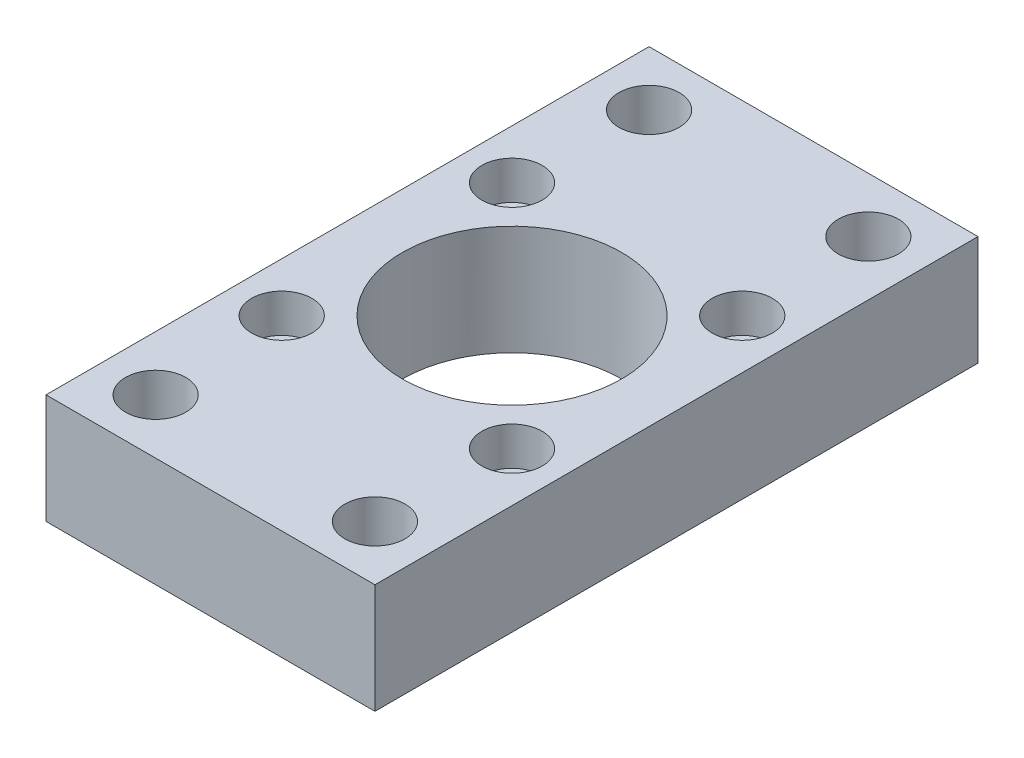
ISO-10303-21;
HEADER;
FILE_DESCRIPTION(('STEP AP214'),'2;1');
FILE_NAME('part.step','',(''),(''),'','','');
FILE_SCHEMA(('AUTOMOTIVE_DESIGN { 1 0 10303 214 1 1 1 1 }'));
ENDSEC;
DATA;
#1=APPLICATION_CONTEXT('core data for automotive mechanical design processes');
#2=APPLICATION_PROTOCOL_DEFINITION('international standard','automotive_design',2000,#1);
#3=PRODUCT_CONTEXT('',#1,'mechanical');
#4=PRODUCT('Part','Part','',(#3));
#5=PRODUCT_RELATED_PRODUCT_CATEGORY('part','',(#4));
#6=PRODUCT_DEFINITION_FORMATION('','',#4);
#7=PRODUCT_DEFINITION_CONTEXT('part definition',#1,'design');
#8=PRODUCT_DEFINITION('design','',#6,#7);
#9=PRODUCT_DEFINITION_SHAPE('','',#8);
#10=(LENGTH_UNIT() NAMED_UNIT(*) SI_UNIT(.MILLI.,.METRE.));
#11=(NAMED_UNIT(*) PLANE_ANGLE_UNIT() SI_UNIT($,.RADIAN.));
#12=(NAMED_UNIT(*) SI_UNIT($,.STERADIAN.) SOLID_ANGLE_UNIT());
#13=UNCERTAINTY_MEASURE_WITH_UNIT(LENGTH_MEASURE(1.E-05),#10,'distance_accuracy_value','');
#14=(GEOMETRIC_REPRESENTATION_CONTEXT(3) GLOBAL_UNCERTAINTY_ASSIGNED_CONTEXT((#13)) GLOBAL_UNIT_ASSIGNED_CONTEXT((#10,
#11,#12)) REPRESENTATION_CONTEXT('',''));
#15=CARTESIAN_POINT('',(0.,0.,0.));
#16=DIRECTION('',(0.,0.,1.));
#17=DIRECTION('',(1.,0.,0.));
#18=AXIS2_PLACEMENT_3D('',#15,#16,#17);
#19=CARTESIAN_POINT('',(-30.,-20.,-55.));
#20=DIRECTION('',(0.,0.,-1.));
#21=DIRECTION('',(0.,1.,0.));
#22=AXIS2_PLACEMENT_3D('',#19,#20,#21);
#23=PLANE('',#22);
#24=DIRECTION('',(1.,0.,0.));
#25=VECTOR('',#24,1.);
#26=CARTESIAN_POINT('',(-30.,0.,-55.));
#27=LINE('',#26,#25);
#28=CARTESIAN_POINT('',(-30.,0.,-55.));
#29=VERTEX_POINT('',#28);
#30=CARTESIAN_POINT('',(30.,0.,-55.));
#31=VERTEX_POINT('',#30);
#32=EDGE_CURVE('E36',#29,#31,#27,.T.);
#33=ORIENTED_EDGE('',*,*,#32,.T.);
#34=DIRECTION('',(0.,1.,0.));
#35=VECTOR('',#34,1.);
#36=CARTESIAN_POINT('',(30.,-20.,-55.));
#37=LINE('',#36,#35);
#38=CARTESIAN_POINT('',(30.,-20.,-55.));
#39=VERTEX_POINT('',#38);
#40=EDGE_CURVE('E73',#39,#31,#37,.T.);
#41=ORIENTED_EDGE('',*,*,#40,.F.);
#42=DIRECTION('',(1.,0.,0.));
#43=VECTOR('',#42,1.);
#44=CARTESIAN_POINT('',(-30.,-20.,-55.));
#45=LINE('',#44,#43);
#46=CARTESIAN_POINT('',(-30.,-20.,-55.));
#47=VERTEX_POINT('',#46);
#48=EDGE_CURVE('E11',#47,#39,#45,.T.);
#49=ORIENTED_EDGE('',*,*,#48,.F.);
#50=DIRECTION('',(0.,1.,0.));
#51=VECTOR('',#50,1.);
#52=CARTESIAN_POINT('',(-30.,-20.,-55.));
#53=LINE('',#52,#51);
#54=EDGE_CURVE('E74',#47,#29,#53,.T.);
#55=ORIENTED_EDGE('',*,*,#54,.T.);
#56=EDGE_LOOP('',(#33,#41,#49,#55));
#57=FACE_BOUND('',#56,.T.);
#58=ADVANCED_FACE('F33',(#57),#23,.T.);
#59=CARTESIAN_POINT('',(-30.,-20.,55.));
#60=DIRECTION('',(0.,-1.,0.));
#61=DIRECTION('',(0.,0.,-1.));
#62=AXIS2_PLACEMENT_3D('',#59,#60,#61);
#63=PLANE('',#62);
#64=CARTESIAN_POINT('',(-20.,-20.,45.));
#65=DIRECTION('',(0.,-1.,0.));
#66=DIRECTION('',(0.,0.,-1.));
#67=AXIS2_PLACEMENT_3D('',#64,#65,#66);
#68=CIRCLE('',#67,5.5);
#69=CARTESIAN_POINT('',(-20.,-20.,39.5));
#70=VERTEX_POINT('',#69);
#71=EDGE_CURVE('E135',#70,#70,#68,.F.);
#72=ORIENTED_EDGE('',*,*,#71,.T.);
#73=EDGE_LOOP('',(#72));
#74=FACE_BOUND('',#73,.T.);
#75=CARTESIAN_POINT('',(20.,-20.,45.));
#76=DIRECTION('',(0.,-1.,0.));
#77=DIRECTION('',(0.,0.,-1.));
#78=AXIS2_PLACEMENT_3D('',#75,#76,#77);
#79=CIRCLE('',#78,5.5);
#80=CARTESIAN_POINT('',(20.,-20.,39.5));
#81=VERTEX_POINT('',#80);
#82=EDGE_CURVE('E139',#81,#81,#79,.F.);
#83=ORIENTED_EDGE('',*,*,#82,.T.);
#84=EDGE_LOOP('',(#83));
#85=FACE_BOUND('',#84,.T.);
#86=CARTESIAN_POINT('',(20.,-20.,-45.));
#87=DIRECTION('',(0.,-1.,0.));
#88=DIRECTION('',(0.,0.,-1.));
#89=AXIS2_PLACEMENT_3D('',#86,#87,#88);
#90=CIRCLE('',#89,5.5);
#91=CARTESIAN_POINT('',(20.,-20.,-50.5));
#92=VERTEX_POINT('',#91);
#93=EDGE_CURVE('E143',#92,#92,#90,.F.);
#94=ORIENTED_EDGE('',*,*,#93,.T.);
#95=EDGE_LOOP('',(#94));
#96=FACE_BOUND('',#95,.T.);
#97=CARTESIAN_POINT('',(-20.,-20.,-45.));
#98=DIRECTION('',(0.,-1.,0.));
#99=DIRECTION('',(0.,0.,-1.));
#100=AXIS2_PLACEMENT_3D('',#97,#98,#99);
#101=CIRCLE('',#100,5.5);
#102=CARTESIAN_POINT('',(-20.,-20.,-50.5));
#103=VERTEX_POINT('',#102);
#104=EDGE_CURVE('E147',#103,#103,#101,.F.);
#105=ORIENTED_EDGE('',*,*,#104,.T.);
#106=EDGE_LOOP('',(#105));
#107=FACE_BOUND('',#106,.T.);
#108=CARTESIAN_POINT('',(-21.,-20.,21.));
#109=DIRECTION('',(0.,-1.,0.));
#110=DIRECTION('',(0.,0.,-1.));
#111=AXIS2_PLACEMENT_3D('',#108,#109,#110);
#112=CIRCLE('',#111,3.25);
#113=CARTESIAN_POINT('',(-21.,-20.,17.75));
#114=VERTEX_POINT('',#113);
#115=EDGE_CURVE('E151',#114,#114,#112,.F.);
#116=ORIENTED_EDGE('',*,*,#115,.T.);
#117=EDGE_LOOP('',(#116));
#118=FACE_BOUND('',#117,.T.);
#119=CARTESIAN_POINT('',(21.,-20.,21.));
#120=DIRECTION('',(0.,-1.,0.));
#121=DIRECTION('',(0.,0.,-1.));
#122=AXIS2_PLACEMENT_3D('',#119,#120,#121);
#123=CIRCLE('',#122,3.25);
#124=CARTESIAN_POINT('',(21.,-20.,17.75));
#125=VERTEX_POINT('',#124);
#126=EDGE_CURVE('E155',#125,#125,#123,.F.);
#127=ORIENTED_EDGE('',*,*,#126,.T.);
#128=EDGE_LOOP('',(#127));
#129=FACE_BOUND('',#128,.T.);
#130=CARTESIAN_POINT('',(21.,-20.,-21.));
#131=DIRECTION('',(0.,-1.,0.));
#132=DIRECTION('',(0.,0.,-1.));
#133=AXIS2_PLACEMENT_3D('',#130,#131,#132);
#134=CIRCLE('',#133,3.25);
#135=CARTESIAN_POINT('',(21.,-20.,-24.25));
#136=VERTEX_POINT('',#135);
#137=EDGE_CURVE('E159',#136,#136,#134,.F.);
#138=ORIENTED_EDGE('',*,*,#137,.T.);
#139=EDGE_LOOP('',(#138));
#140=FACE_BOUND('',#139,.T.);
#141=CARTESIAN_POINT('',(-21.,-20.,-21.));
#142=DIRECTION('',(0.,-1.,0.));
#143=DIRECTION('',(0.,0.,-1.));
#144=AXIS2_PLACEMENT_3D('',#141,#142,#143);
#145=CIRCLE('',#144,3.25);
#146=CARTESIAN_POINT('',(-21.,-20.,-24.25));
#147=VERTEX_POINT('',#146);
#148=EDGE_CURVE('E163',#147,#147,#145,.F.);
#149=ORIENTED_EDGE('',*,*,#148,.T.);
#150=EDGE_LOOP('',(#149));
#151=FACE_BOUND('',#150,.T.);
#152=CARTESIAN_POINT('',(0.,-20.,0.));
#153=DIRECTION('',(0.,-1.,0.));
#154=DIRECTION('',(0.,0.,-1.));
#155=AXIS2_PLACEMENT_3D('',#152,#153,#154);
#156=CIRCLE('',#155,20.);
#157=CARTESIAN_POINT('',(0.,-20.,-20.));
#158=VERTEX_POINT('',#157);
#159=EDGE_CURVE('E94',#158,#158,#156,.F.);
#160=ORIENTED_EDGE('',*,*,#159,.T.);
#161=EDGE_LOOP('',(#160));
#162=FACE_BOUND('',#161,.T.);
#163=ORIENTED_EDGE('',*,*,#48,.T.);
#164=DIRECTION('',(0.,0.,-1.));
#165=VECTOR('',#164,1.);
#166=CARTESIAN_POINT('',(30.,-20.,55.));
#167=LINE('',#166,#165);
#168=CARTESIAN_POINT('',(30.,-20.,55.));
#169=VERTEX_POINT('',#168);
#170=EDGE_CURVE('E90',#169,#39,#167,.T.);
#171=ORIENTED_EDGE('',*,*,#170,.F.);
#172=DIRECTION('',(1.,0.,0.));
#173=VECTOR('',#172,1.);
#174=CARTESIAN_POINT('',(-30.,-20.,55.));
#175=LINE('',#174,#173);
#176=CARTESIAN_POINT('',(-30.,-20.,55.));
#177=VERTEX_POINT('',#176);
#178=EDGE_CURVE('E41',#177,#169,#175,.T.);
#179=ORIENTED_EDGE('',*,*,#178,.F.);
#180=DIRECTION('',(0.,0.,-1.));
#181=VECTOR('',#180,1.);
#182=CARTESIAN_POINT('',(-30.,-20.,55.));
#183=LINE('',#182,#181);
#184=EDGE_CURVE('E79',#177,#47,#183,.T.);
#185=ORIENTED_EDGE('',*,*,#184,.T.);
#186=EDGE_LOOP('',(#163,#171,#179,#185));
#187=FACE_BOUND('',#186,.T.);
#188=ADVANCED_FACE('F110',(#74,#85,#96,#107,#118,#129,#140,#151,#162,#187),#63,.T.);
#189=CARTESIAN_POINT('',(-30.,0.,55.));
#190=DIRECTION('',(0.,0.,1.));
#191=DIRECTION('',(0.,-1.,0.));
#192=AXIS2_PLACEMENT_3D('',#189,#190,#191);
#193=PLANE('',#192);
#194=ORIENTED_EDGE('',*,*,#178,.T.);
#195=DIRECTION('',(0.,-1.,0.));
#196=VECTOR('',#195,1.);
#197=CARTESIAN_POINT('',(30.,0.,55.));
#198=LINE('',#197,#196);
#199=CARTESIAN_POINT('',(30.,0.,55.));
#200=VERTEX_POINT('',#199);
#201=EDGE_CURVE('E86',#200,#169,#198,.T.);
#202=ORIENTED_EDGE('',*,*,#201,.F.);
#203=DIRECTION('',(1.,0.,0.));
#204=VECTOR('',#203,1.);
#205=CARTESIAN_POINT('',(-30.,0.,55.));
#206=LINE('',#205,#204);
#207=CARTESIAN_POINT('',(-30.,0.,55.));
#208=VERTEX_POINT('',#207);
#209=EDGE_CURVE('E78',#208,#200,#206,.T.);
#210=ORIENTED_EDGE('',*,*,#209,.F.);
#211=DIRECTION('',(0.,-1.,0.));
#212=VECTOR('',#211,1.);
#213=CARTESIAN_POINT('',(-30.,0.,55.));
#214=LINE('',#213,#212);
#215=EDGE_CURVE('E103',#208,#177,#214,.T.);
#216=ORIENTED_EDGE('',*,*,#215,.T.);
#217=EDGE_LOOP('',(#194,#202,#210,#216));
#218=FACE_BOUND('',#217,.T.);
#219=ADVANCED_FACE('F107',(#218),#193,.T.);
#220=CARTESIAN_POINT('',(-30.,0.,-55.));
#221=DIRECTION('',(0.,1.,0.));
#222=DIRECTION('',(0.,0.,1.));
#223=AXIS2_PLACEMENT_3D('',#220,#221,#222);
#224=PLANE('',#223);
#225=CARTESIAN_POINT('',(-20.,0.,45.));
#226=DIRECTION('',(0.,1.,0.));
#227=DIRECTION('',(0.,0.,1.));
#228=AXIS2_PLACEMENT_3D('',#225,#226,#227);
#229=CIRCLE('',#228,5.5);
#230=CARTESIAN_POINT('',(-20.,0.,50.5));
#231=VERTEX_POINT('',#230);
#232=EDGE_CURVE('E220',#231,#231,#229,.T.);
#233=ORIENTED_EDGE('',*,*,#232,.F.);
#234=EDGE_LOOP('',(#233));
#235=FACE_BOUND('',#234,.T.);
#236=CARTESIAN_POINT('',(20.,0.,45.));
#237=DIRECTION('',(0.,1.,0.));
#238=DIRECTION('',(0.,0.,1.));
#239=AXIS2_PLACEMENT_3D('',#236,#237,#238);
#240=CIRCLE('',#239,5.5);
#241=CARTESIAN_POINT('',(20.,0.,50.5));
#242=VERTEX_POINT('',#241);
#243=EDGE_CURVE('E216',#242,#242,#240,.T.);
#244=ORIENTED_EDGE('',*,*,#243,.F.);
#245=EDGE_LOOP('',(#244));
#246=FACE_BOUND('',#245,.T.);
#247=CARTESIAN_POINT('',(20.,0.,-45.));
#248=DIRECTION('',(0.,1.,0.));
#249=DIRECTION('',(0.,0.,1.));
#250=AXIS2_PLACEMENT_3D('',#247,#248,#249);
#251=CIRCLE('',#250,5.5);
#252=CARTESIAN_POINT('',(20.,0.,-39.5));
#253=VERTEX_POINT('',#252);
#254=EDGE_CURVE('E212',#253,#253,#251,.T.);
#255=ORIENTED_EDGE('',*,*,#254,.F.);
#256=EDGE_LOOP('',(#255));
#257=FACE_BOUND('',#256,.T.);
#258=CARTESIAN_POINT('',(-20.,0.,-45.));
#259=DIRECTION('',(0.,1.,0.));
#260=DIRECTION('',(0.,0.,1.));
#261=AXIS2_PLACEMENT_3D('',#258,#259,#260);
#262=CIRCLE('',#261,5.5);
#263=CARTESIAN_POINT('',(-20.,0.,-39.5));
#264=VERTEX_POINT('',#263);
#265=EDGE_CURVE('E208',#264,#264,#262,.T.);
#266=ORIENTED_EDGE('',*,*,#265,.F.);
#267=EDGE_LOOP('',(#266));
#268=FACE_BOUND('',#267,.T.);
#269=CARTESIAN_POINT('',(-21.,0.,21.));
#270=DIRECTION('',(0.,1.,0.));
#271=DIRECTION('',(0.,0.,1.));
#272=AXIS2_PLACEMENT_3D('',#269,#270,#271);
#273=CIRCLE('',#272,5.5);
#274=CARTESIAN_POINT('',(-21.,0.,26.5));
#275=VERTEX_POINT('',#274);
#276=EDGE_CURVE('E189',#275,#275,#273,.T.);
#277=ORIENTED_EDGE('',*,*,#276,.F.);
#278=EDGE_LOOP('',(#277));
#279=FACE_BOUND('',#278,.T.);
#280=CARTESIAN_POINT('',(21.,0.,21.));
#281=DIRECTION('',(0.,1.,0.));
#282=DIRECTION('',(0.,0.,1.));
#283=AXIS2_PLACEMENT_3D('',#280,#281,#282);
#284=CIRCLE('',#283,5.5);
#285=CARTESIAN_POINT('',(21.,0.,26.5));
#286=VERTEX_POINT('',#285);
#287=EDGE_CURVE('E183',#286,#286,#284,.T.);
#288=ORIENTED_EDGE('',*,*,#287,.F.);
#289=EDGE_LOOP('',(#288));
#290=FACE_BOUND('',#289,.T.);
#291=CARTESIAN_POINT('',(21.,0.,-21.));
#292=DIRECTION('',(0.,1.,0.));
#293=DIRECTION('',(0.,0.,1.));
#294=AXIS2_PLACEMENT_3D('',#291,#292,#293);
#295=CIRCLE('',#294,5.5);
#296=CARTESIAN_POINT('',(21.,0.,-15.5));
#297=VERTEX_POINT('',#296);
#298=EDGE_CURVE('E177',#297,#297,#295,.T.);
#299=ORIENTED_EDGE('',*,*,#298,.F.);
#300=EDGE_LOOP('',(#299));
#301=FACE_BOUND('',#300,.T.);
#302=CARTESIAN_POINT('',(-21.,0.,-21.));
#303=DIRECTION('',(0.,1.,0.));
#304=DIRECTION('',(0.,0.,1.));
#305=AXIS2_PLACEMENT_3D('',#302,#303,#304);
#306=CIRCLE('',#305,5.5);
#307=CARTESIAN_POINT('',(-21.,0.,-15.5));
#308=VERTEX_POINT('',#307);
#309=EDGE_CURVE('E169',#308,#308,#306,.T.);
#310=ORIENTED_EDGE('',*,*,#309,.F.);
#311=EDGE_LOOP('',(#310));
#312=FACE_BOUND('',#311,.T.);
#313=CARTESIAN_POINT('',(0.,0.,0.));
#314=DIRECTION('',(0.,1.,0.));
#315=DIRECTION('',(0.,0.,1.));
#316=AXIS2_PLACEMENT_3D('',#313,#314,#315);
#317=CIRCLE('',#316,20.);
#318=CARTESIAN_POINT('',(0.,0.,20.));
#319=VERTEX_POINT('',#318);
#320=EDGE_CURVE('E91',#319,#319,#317,.T.);
#321=ORIENTED_EDGE('',*,*,#320,.F.);
#322=EDGE_LOOP('',(#321));
#323=FACE_BOUND('',#322,.T.);
#324=ORIENTED_EDGE('',*,*,#209,.T.);
#325=DIRECTION('',(0.,0.,1.));
#326=VECTOR('',#325,1.);
#327=CARTESIAN_POINT('',(30.,0.,-55.));
#328=LINE('',#327,#326);
#329=EDGE_CURVE('E81',#31,#200,#328,.T.);
#330=ORIENTED_EDGE('',*,*,#329,.F.);
#331=ORIENTED_EDGE('',*,*,#32,.F.);
#332=DIRECTION('',(0.,0.,1.));
#333=VECTOR('',#332,1.);
#334=CARTESIAN_POINT('',(-30.,0.,-55.));
#335=LINE('',#334,#333);
#336=EDGE_CURVE('E101',#29,#208,#335,.T.);
#337=ORIENTED_EDGE('',*,*,#336,.T.);
#338=EDGE_LOOP('',(#324,#330,#331,#337));
#339=FACE_BOUND('',#338,.T.);
#340=ADVANCED_FACE('F82',(#235,#246,#257,#268,#279,#290,#301,#312,#323,#339),#224,.T.);
#341=CARTESIAN_POINT('',(-30.,0.,0.));
#342=DIRECTION('',(1.,0.,0.));
#343=DIRECTION('',(0.,0.,-1.));
#344=AXIS2_PLACEMENT_3D('',#341,#342,#343);
#345=PLANE('',#344);
#346=ORIENTED_EDGE('',*,*,#54,.F.);
#347=ORIENTED_EDGE('',*,*,#184,.F.);
#348=ORIENTED_EDGE('',*,*,#215,.F.);
#349=ORIENTED_EDGE('',*,*,#336,.F.);
#350=EDGE_LOOP('',(#346,#347,#348,#349));
#351=FACE_BOUND('',#350,.T.);
#352=ADVANCED_FACE('F112',(#351),#345,.F.);
#353=CARTESIAN_POINT('',(30.,0.,0.));
#354=DIRECTION('',(1.,0.,0.));
#355=DIRECTION('',(0.,0.,-1.));
#356=AXIS2_PLACEMENT_3D('',#353,#354,#355);
#357=PLANE('',#356);
#358=ORIENTED_EDGE('',*,*,#40,.T.);
#359=ORIENTED_EDGE('',*,*,#329,.T.);
#360=ORIENTED_EDGE('',*,*,#201,.T.);
#361=ORIENTED_EDGE('',*,*,#170,.T.);
#362=EDGE_LOOP('',(#358,#359,#360,#361));
#363=FACE_BOUND('',#362,.T.);
#364=ADVANCED_FACE('F89',(#363),#357,.T.);
#365=CARTESIAN_POINT('',(0.,-20.001,0.));
#366=DIRECTION('',(0.,1.,0.));
#367=DIRECTION('',(0.,0.,1.));
#368=AXIS2_PLACEMENT_3D('',#365,#366,#367);
#369=CYLINDRICAL_SURFACE('',#368,20.);
#370=ORIENTED_EDGE('',*,*,#159,.F.);
#371=EDGE_LOOP('',(#370));
#372=FACE_BOUND('',#371,.T.);
#373=ORIENTED_EDGE('',*,*,#320,.T.);
#374=EDGE_LOOP('',(#373));
#375=FACE_BOUND('',#374,.T.);
#376=ADVANCED_FACE('F119',(#372,#375),#369,.F.);
#377=CARTESIAN_POINT('',(-21.,-7.,-21.));
#378=DIRECTION('',(0.,1.,0.));
#379=DIRECTION('',(0.,0.,1.));
#380=AXIS2_PLACEMENT_3D('',#377,#378,#379);
#381=CYLINDRICAL_SURFACE('',#380,5.5);
#382=CARTESIAN_POINT('',(-21.,-7.,-21.));
#383=DIRECTION('',(0.,1.,0.));
#384=DIRECTION('',(0.,0.,1.));
#385=AXIS2_PLACEMENT_3D('',#382,#383,#384);
#386=CIRCLE('',#385,5.5);
#387=CARTESIAN_POINT('',(-21.,-7.,-15.5));
#388=VERTEX_POINT('',#387);
#389=EDGE_CURVE('E167',#388,#388,#386,.T.);
#390=ORIENTED_EDGE('',*,*,#389,.F.);
#391=EDGE_LOOP('',(#390));
#392=FACE_BOUND('',#391,.T.);
#393=ORIENTED_EDGE('',*,*,#309,.T.);
#394=EDGE_LOOP('',(#393));
#395=FACE_BOUND('',#394,.T.);
#396=ADVANCED_FACE('F246',(#392,#395),#381,.F.);
#397=CARTESIAN_POINT('',(-21.,-7.,-21.));
#398=DIRECTION('',(0.,1.,0.));
#399=DIRECTION('',(0.,0.,1.));
#400=AXIS2_PLACEMENT_3D('',#397,#398,#399);
#401=PLANE('',#400);
#402=CARTESIAN_POINT('',(-21.,-7.,-21.));
#403=DIRECTION('',(0.,1.,0.));
#404=DIRECTION('',(0.,0.,1.));
#405=AXIS2_PLACEMENT_3D('',#402,#403,#404);
#406=CIRCLE('',#405,3.25);
#407=CARTESIAN_POINT('',(-21.,-7.,-17.75));
#408=VERTEX_POINT('',#407);
#409=EDGE_CURVE('E192',#408,#408,#406,.T.);
#410=ORIENTED_EDGE('',*,*,#409,.F.);
#411=EDGE_LOOP('',(#410));
#412=FACE_BOUND('',#411,.T.);
#413=ORIENTED_EDGE('',*,*,#389,.T.);
#414=EDGE_LOOP('',(#413));
#415=FACE_BOUND('',#414,.T.);
#416=ADVANCED_FACE('F251',(#412,#415),#401,.T.);
#417=CARTESIAN_POINT('',(21.,-7.,-21.));
#418=DIRECTION('',(0.,1.,0.));
#419=DIRECTION('',(0.,0.,1.));
#420=AXIS2_PLACEMENT_3D('',#417,#418,#419);
#421=CYLINDRICAL_SURFACE('',#420,5.5);
#422=CARTESIAN_POINT('',(21.,-7.,-21.));
#423=DIRECTION('',(0.,1.,0.));
#424=DIRECTION('',(0.,0.,1.));
#425=AXIS2_PLACEMENT_3D('',#422,#423,#424);
#426=CIRCLE('',#425,5.5);
#427=CARTESIAN_POINT('',(21.,-7.,-15.5));
#428=VERTEX_POINT('',#427);
#429=EDGE_CURVE('E174',#428,#428,#426,.T.);
#430=ORIENTED_EDGE('',*,*,#429,.F.);
#431=EDGE_LOOP('',(#430));
#432=FACE_BOUND('',#431,.T.);
#433=ORIENTED_EDGE('',*,*,#298,.T.);
#434=EDGE_LOOP('',(#433));
#435=FACE_BOUND('',#434,.T.);
#436=ADVANCED_FACE('F257',(#432,#435),#421,.F.);
#437=CARTESIAN_POINT('',(21.,-7.,-21.));
#438=DIRECTION('',(0.,1.,0.));
#439=DIRECTION('',(0.,0.,1.));
#440=AXIS2_PLACEMENT_3D('',#437,#438,#439);
#441=PLANE('',#440);
#442=CARTESIAN_POINT('',(21.,-7.,-21.));
#443=DIRECTION('',(0.,1.,0.));
#444=DIRECTION('',(0.,0.,1.));
#445=AXIS2_PLACEMENT_3D('',#442,#443,#444);
#446=CIRCLE('',#445,3.25);
#447=CARTESIAN_POINT('',(21.,-7.,-17.75));
#448=VERTEX_POINT('',#447);
#449=EDGE_CURVE('E196',#448,#448,#446,.T.);
#450=ORIENTED_EDGE('',*,*,#449,.F.);
#451=EDGE_LOOP('',(#450));
#452=FACE_BOUND('',#451,.T.);
#453=ORIENTED_EDGE('',*,*,#429,.T.);
#454=EDGE_LOOP('',(#453));
#455=FACE_BOUND('',#454,.T.);
#456=ADVANCED_FACE('F261',(#452,#455),#441,.T.);
#457=CARTESIAN_POINT('',(21.,-7.,21.));
#458=DIRECTION('',(0.,1.,0.));
#459=DIRECTION('',(0.,0.,1.));
#460=AXIS2_PLACEMENT_3D('',#457,#458,#459);
#461=CYLINDRICAL_SURFACE('',#460,5.5);
#462=CARTESIAN_POINT('',(21.,-7.,21.));
#463=DIRECTION('',(0.,1.,0.));
#464=DIRECTION('',(0.,0.,1.));
#465=AXIS2_PLACEMENT_3D('',#462,#463,#464);
#466=CIRCLE('',#465,5.5);
#467=CARTESIAN_POINT('',(21.,-7.,26.5));
#468=VERTEX_POINT('',#467);
#469=EDGE_CURVE('E180',#468,#468,#466,.T.);
#470=ORIENTED_EDGE('',*,*,#469,.F.);
#471=EDGE_LOOP('',(#470));
#472=FACE_BOUND('',#471,.T.);
#473=ORIENTED_EDGE('',*,*,#287,.T.);
#474=EDGE_LOOP('',(#473));
#475=FACE_BOUND('',#474,.T.);
#476=ADVANCED_FACE('F265',(#472,#475),#461,.F.);
#477=CARTESIAN_POINT('',(21.,-7.,21.));
#478=DIRECTION('',(0.,1.,0.));
#479=DIRECTION('',(0.,0.,1.));
#480=AXIS2_PLACEMENT_3D('',#477,#478,#479);
#481=PLANE('',#480);
#482=CARTESIAN_POINT('',(21.,-7.,21.));
#483=DIRECTION('',(0.,1.,0.));
#484=DIRECTION('',(0.,0.,1.));
#485=AXIS2_PLACEMENT_3D('',#482,#483,#484);
#486=CIRCLE('',#485,3.25);
#487=CARTESIAN_POINT('',(21.,-7.,24.25));
#488=VERTEX_POINT('',#487);
#489=EDGE_CURVE('E200',#488,#488,#486,.T.);
#490=ORIENTED_EDGE('',*,*,#489,.F.);
#491=EDGE_LOOP('',(#490));
#492=FACE_BOUND('',#491,.T.);
#493=ORIENTED_EDGE('',*,*,#469,.T.);
#494=EDGE_LOOP('',(#493));
#495=FACE_BOUND('',#494,.T.);
#496=ADVANCED_FACE('F269',(#492,#495),#481,.T.);
#497=CARTESIAN_POINT('',(-21.,-7.,21.));
#498=DIRECTION('',(0.,1.,0.));
#499=DIRECTION('',(0.,0.,1.));
#500=AXIS2_PLACEMENT_3D('',#497,#498,#499);
#501=CYLINDRICAL_SURFACE('',#500,5.5);
#502=CARTESIAN_POINT('',(-21.,-7.,21.));
#503=DIRECTION('',(0.,1.,0.));
#504=DIRECTION('',(0.,0.,1.));
#505=AXIS2_PLACEMENT_3D('',#502,#503,#504);
#506=CIRCLE('',#505,5.5);
#507=CARTESIAN_POINT('',(-21.,-7.,26.5));
#508=VERTEX_POINT('',#507);
#509=EDGE_CURVE('E186',#508,#508,#506,.T.);
#510=ORIENTED_EDGE('',*,*,#509,.F.);
#511=EDGE_LOOP('',(#510));
#512=FACE_BOUND('',#511,.T.);
#513=ORIENTED_EDGE('',*,*,#276,.T.);
#514=EDGE_LOOP('',(#513));
#515=FACE_BOUND('',#514,.T.);
#516=ADVANCED_FACE('F273',(#512,#515),#501,.F.);
#517=CARTESIAN_POINT('',(-21.,-7.,21.));
#518=DIRECTION('',(0.,1.,0.));
#519=DIRECTION('',(0.,0.,1.));
#520=AXIS2_PLACEMENT_3D('',#517,#518,#519);
#521=PLANE('',#520);
#522=CARTESIAN_POINT('',(-21.,-7.,21.));
#523=DIRECTION('',(0.,1.,0.));
#524=DIRECTION('',(0.,0.,1.));
#525=AXIS2_PLACEMENT_3D('',#522,#523,#524);
#526=CIRCLE('',#525,3.25);
#527=CARTESIAN_POINT('',(-21.,-7.,24.25));
#528=VERTEX_POINT('',#527);
#529=EDGE_CURVE('E204',#528,#528,#526,.T.);
#530=ORIENTED_EDGE('',*,*,#529,.F.);
#531=EDGE_LOOP('',(#530));
#532=FACE_BOUND('',#531,.T.);
#533=ORIENTED_EDGE('',*,*,#509,.T.);
#534=EDGE_LOOP('',(#533));
#535=FACE_BOUND('',#534,.T.);
#536=ADVANCED_FACE('F277',(#532,#535),#521,.T.);
#537=CARTESIAN_POINT('',(-21.,-20.001,-21.));
#538=DIRECTION('',(0.,1.,0.));
#539=DIRECTION('',(0.,0.,1.));
#540=AXIS2_PLACEMENT_3D('',#537,#538,#539);
#541=CYLINDRICAL_SURFACE('',#540,3.25);
#542=ORIENTED_EDGE('',*,*,#148,.F.);
#543=EDGE_LOOP('',(#542));
#544=FACE_BOUND('',#543,.T.);
#545=ORIENTED_EDGE('',*,*,#409,.T.);
#546=EDGE_LOOP('',(#545));
#547=FACE_BOUND('',#546,.T.);
#548=ADVANCED_FACE('F281',(#544,#547),#541,.F.);
#549=CARTESIAN_POINT('',(21.,-20.001,-21.));
#550=DIRECTION('',(0.,1.,0.));
#551=DIRECTION('',(0.,0.,1.));
#552=AXIS2_PLACEMENT_3D('',#549,#550,#551);
#553=CYLINDRICAL_SURFACE('',#552,3.25);
#554=ORIENTED_EDGE('',*,*,#137,.F.);
#555=EDGE_LOOP('',(#554));
#556=FACE_BOUND('',#555,.T.);
#557=ORIENTED_EDGE('',*,*,#449,.T.);
#558=EDGE_LOOP('',(#557));
#559=FACE_BOUND('',#558,.T.);
#560=ADVANCED_FACE('F285',(#556,#559),#553,.F.);
#561=CARTESIAN_POINT('',(21.,-20.001,21.));
#562=DIRECTION('',(0.,1.,0.));
#563=DIRECTION('',(0.,0.,1.));
#564=AXIS2_PLACEMENT_3D('',#561,#562,#563);
#565=CYLINDRICAL_SURFACE('',#564,3.25);
#566=ORIENTED_EDGE('',*,*,#126,.F.);
#567=EDGE_LOOP('',(#566));
#568=FACE_BOUND('',#567,.T.);
#569=ORIENTED_EDGE('',*,*,#489,.T.);
#570=EDGE_LOOP('',(#569));
#571=FACE_BOUND('',#570,.T.);
#572=ADVANCED_FACE('F289',(#568,#571),#565,.F.);
#573=CARTESIAN_POINT('',(-21.,-20.001,21.));
#574=DIRECTION('',(0.,1.,0.));
#575=DIRECTION('',(0.,0.,1.));
#576=AXIS2_PLACEMENT_3D('',#573,#574,#575);
#577=CYLINDRICAL_SURFACE('',#576,3.25);
#578=ORIENTED_EDGE('',*,*,#115,.F.);
#579=EDGE_LOOP('',(#578));
#580=FACE_BOUND('',#579,.T.);
#581=ORIENTED_EDGE('',*,*,#529,.T.);
#582=EDGE_LOOP('',(#581));
#583=FACE_BOUND('',#582,.T.);
#584=ADVANCED_FACE('F293',(#580,#583),#577,.F.);
#585=CARTESIAN_POINT('',(-20.,-20.001,-45.));
#586=DIRECTION('',(0.,1.,0.));
#587=DIRECTION('',(0.,0.,1.));
#588=AXIS2_PLACEMENT_3D('',#585,#586,#587);
#589=CYLINDRICAL_SURFACE('',#588,5.5);
#590=ORIENTED_EDGE('',*,*,#104,.F.);
#591=EDGE_LOOP('',(#590));
#592=FACE_BOUND('',#591,.T.);
#593=ORIENTED_EDGE('',*,*,#265,.T.);
#594=EDGE_LOOP('',(#593));
#595=FACE_BOUND('',#594,.T.);
#596=ADVANCED_FACE('F297',(#592,#595),#589,.F.);
#597=CARTESIAN_POINT('',(20.,-20.001,-45.));
#598=DIRECTION('',(0.,1.,0.));
#599=DIRECTION('',(0.,0.,1.));
#600=AXIS2_PLACEMENT_3D('',#597,#598,#599);
#601=CYLINDRICAL_SURFACE('',#600,5.5);
#602=ORIENTED_EDGE('',*,*,#93,.F.);
#603=EDGE_LOOP('',(#602));
#604=FACE_BOUND('',#603,.T.);
#605=ORIENTED_EDGE('',*,*,#254,.T.);
#606=EDGE_LOOP('',(#605));
#607=FACE_BOUND('',#606,.T.);
#608=ADVANCED_FACE('F301',(#604,#607),#601,.F.);
#609=CARTESIAN_POINT('',(20.,-20.001,45.));
#610=DIRECTION('',(0.,1.,0.));
#611=DIRECTION('',(0.,0.,1.));
#612=AXIS2_PLACEMENT_3D('',#609,#610,#611);
#613=CYLINDRICAL_SURFACE('',#612,5.5);
#614=ORIENTED_EDGE('',*,*,#82,.F.);
#615=EDGE_LOOP('',(#614));
#616=FACE_BOUND('',#615,.T.);
#617=ORIENTED_EDGE('',*,*,#243,.T.);
#618=EDGE_LOOP('',(#617));
#619=FACE_BOUND('',#618,.T.);
#620=ADVANCED_FACE('F305',(#616,#619),#613,.F.);
#621=CARTESIAN_POINT('',(-20.,-20.001,45.));
#622=DIRECTION('',(0.,1.,0.));
#623=DIRECTION('',(0.,0.,1.));
#624=AXIS2_PLACEMENT_3D('',#621,#622,#623);
#625=CYLINDRICAL_SURFACE('',#624,5.5);
#626=ORIENTED_EDGE('',*,*,#71,.F.);
#627=EDGE_LOOP('',(#626));
#628=FACE_BOUND('',#627,.T.);
#629=ORIENTED_EDGE('',*,*,#232,.T.);
#630=EDGE_LOOP('',(#629));
#631=FACE_BOUND('',#630,.T.);
#632=ADVANCED_FACE('F227',(#628,#631),#625,.F.);
#633=CLOSED_SHELL('',(#58,#188,#219,#340,#352,#364,#376,#396,#416,#436,#456,#476,#496,#516,#536,
#548,#560,#572,#584,#596,#608,#620,#632));
#634=MANIFOLD_SOLID_BREP('B2',#633);
#635=ADVANCED_BREP_SHAPE_REPRESENTATION('',(#18,#634),#14);
#636=SHAPE_DEFINITION_REPRESENTATION(#9,#635);
ENDSEC;
END-ISO-10303-21;
